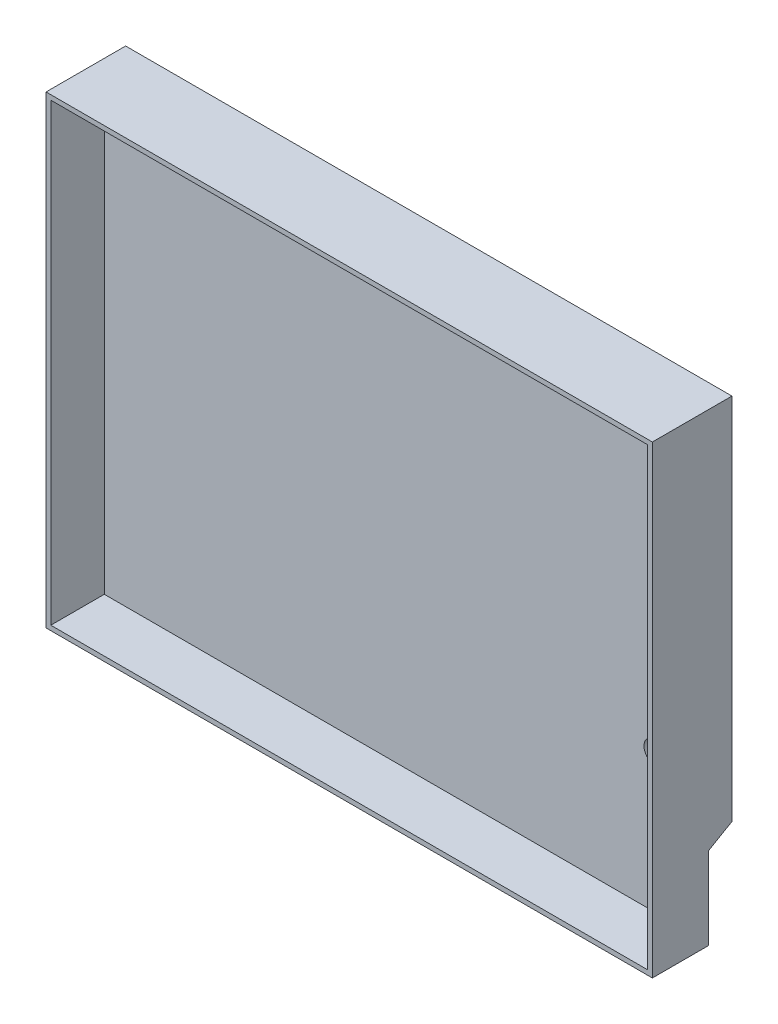
ISO-10303-21;
HEADER;
FILE_DESCRIPTION(('STEP AP214'),'2;1');
FILE_NAME('part.step','',(''),(''),'','','');
FILE_SCHEMA(('AUTOMOTIVE_DESIGN { 1 0 10303 214 1 1 1 1 }'));
ENDSEC;
DATA;
#1=APPLICATION_CONTEXT('core data for automotive mechanical design processes');
#2=APPLICATION_PROTOCOL_DEFINITION('international standard','automotive_design',2000,#1);
#3=PRODUCT_CONTEXT('',#1,'mechanical');
#4=PRODUCT('Part','Part','',(#3));
#5=PRODUCT_RELATED_PRODUCT_CATEGORY('part','',(#4));
#6=PRODUCT_DEFINITION_FORMATION('','',#4);
#7=PRODUCT_DEFINITION_CONTEXT('part definition',#1,'design');
#8=PRODUCT_DEFINITION('design','',#6,#7);
#9=PRODUCT_DEFINITION_SHAPE('','',#8);
#10=(LENGTH_UNIT() NAMED_UNIT(*) SI_UNIT(.MILLI.,.METRE.));
#11=(NAMED_UNIT(*) PLANE_ANGLE_UNIT() SI_UNIT($,.RADIAN.));
#12=(NAMED_UNIT(*) SI_UNIT($,.STERADIAN.) SOLID_ANGLE_UNIT());
#13=UNCERTAINTY_MEASURE_WITH_UNIT(LENGTH_MEASURE(1.E-05),#10,'distance_accuracy_value','');
#14=(GEOMETRIC_REPRESENTATION_CONTEXT(3) GLOBAL_UNCERTAINTY_ASSIGNED_CONTEXT((#13)) GLOBAL_UNIT_ASSIGNED_CONTEXT((#10,
#11,#12)) REPRESENTATION_CONTEXT('',''));
#15=CARTESIAN_POINT('',(0.,0.,0.));
#16=DIRECTION('',(0.,0.,1.));
#17=DIRECTION('',(1.,0.,0.));
#18=AXIS2_PLACEMENT_3D('',#15,#16,#17);
#19=CARTESIAN_POINT('',(-73.6844666960611,-68.0045533803645,11.8));
#20=DIRECTION('',(1.,0.,0.));
#21=DIRECTION('',(0.,0.,-1.));
#22=AXIS2_PLACEMENT_3D('',#19,#20,#21);
#23=PLANE('',#22);
#24=DIRECTION('',(0.,0.,-1.));
#25=VECTOR('',#24,1.);
#26=CARTESIAN_POINT('',(-73.6844666960611,29.9954466196355,11.8));
#27=LINE('',#26,#25);
#28=CARTESIAN_POINT('',(-73.6844666960611,29.9954466196355,11.8));
#29=VERTEX_POINT('',#28);
#30=CARTESIAN_POINT('',(-73.6844666960611,29.9954466196355,-4.99696657983621));
#31=VERTEX_POINT('',#30);
#32=EDGE_CURVE('E133',#29,#31,#27,.T.);
#33=ORIENTED_EDGE('',*,*,#32,.T.);
#34=DIRECTION('',(0.,-1.,0.));
#35=VECTOR('',#34,1.);
#36=CARTESIAN_POINT('',(-73.6844666960611,-47.7995533803645,-4.99696657983621));
#37=LINE('',#36,#35);
#38=CARTESIAN_POINT('',(-73.6844666960611,-47.7995533803645,-4.99696657983621));
#39=VERTEX_POINT('',#38);
#40=EDGE_CURVE('E141',#31,#39,#37,.T.);
#41=ORIENTED_EDGE('',*,*,#40,.T.);
#42=DIRECTION('',(0.,-0.5,0.866025403784439));
#43=VECTOR('',#42,1.);
#44=CARTESIAN_POINT('',(-73.6844666960611,-50.6845533803645,0.));
#45=LINE('',#44,#43);
#46=CARTESIAN_POINT('',(-73.6844666960611,-50.6845533803645,0.));
#47=VERTEX_POINT('',#46);
#48=EDGE_CURVE('E149',#39,#47,#45,.T.);
#49=ORIENTED_EDGE('',*,*,#48,.T.);
#50=DIRECTION('',(0.,-1.,0.));
#51=VECTOR('',#50,1.);
#52=CARTESIAN_POINT('',(-73.6844666960611,-68.0045533803645,0.));
#53=LINE('',#52,#51);
#54=CARTESIAN_POINT('',(-73.6844666960611,-68.0045533803645,0.));
#55=VERTEX_POINT('',#54);
#56=EDGE_CURVE('E200',#47,#55,#53,.T.);
#57=ORIENTED_EDGE('',*,*,#56,.T.);
#58=DIRECTION('',(0.,0.,-1.));
#59=VECTOR('',#58,1.);
#60=CARTESIAN_POINT('',(-73.6844666960611,-68.0045533803645,11.8));
#61=LINE('',#60,#59);
#62=CARTESIAN_POINT('',(-73.6844666960611,-68.0045533803645,11.8));
#63=VERTEX_POINT('',#62);
#64=EDGE_CURVE('E11',#63,#55,#61,.T.);
#65=ORIENTED_EDGE('',*,*,#64,.F.);
#66=DIRECTION('',(0.,-1.,0.));
#67=VECTOR('',#66,1.);
#68=CARTESIAN_POINT('',(-73.6844666960611,-68.0045533803645,11.8));
#69=LINE('',#68,#67);
#70=EDGE_CURVE('E209',#29,#63,#69,.T.);
#71=ORIENTED_EDGE('',*,*,#70,.F.);
#72=EDGE_LOOP('',(#33,#41,#49,#57,#65,#71));
#73=FACE_BOUND('',#72,.T.);
#74=ADVANCED_FACE('F43',(#73),#23,.F.);
#75=CARTESIAN_POINT('',(54.3155333039389,-68.0045533803645,11.8));
#76=DIRECTION('',(0.,1.,0.));
#77=DIRECTION('',(-1.,0.,0.));
#78=AXIS2_PLACEMENT_3D('',#75,#76,#77);
#79=PLANE('',#78);
#80=DIRECTION('',(1.,0.,0.));
#81=VECTOR('',#80,1.);
#82=CARTESIAN_POINT('',(54.3155333039389,-68.0045533803645,0.));
#83=LINE('',#82,#81);
#84=CARTESIAN_POINT('',(54.3155333039389,-68.0045533803645,0.));
#85=VERTEX_POINT('',#84);
#86=EDGE_CURVE('E224',#55,#85,#83,.T.);
#87=ORIENTED_EDGE('',*,*,#86,.T.);
#88=DIRECTION('',(0.,0.,-1.));
#89=VECTOR('',#88,1.);
#90=CARTESIAN_POINT('',(54.3155333039389,-68.0045533803645,11.8));
#91=LINE('',#90,#89);
#92=CARTESIAN_POINT('',(54.3155333039389,-68.0045533803645,11.8));
#93=VERTEX_POINT('',#92);
#94=EDGE_CURVE('E51',#93,#85,#91,.T.);
#95=ORIENTED_EDGE('',*,*,#94,.F.);
#96=DIRECTION('',(1.,0.,0.));
#97=VECTOR('',#96,1.);
#98=CARTESIAN_POINT('',(54.3155333039389,-68.0045533803645,11.8));
#99=LINE('',#98,#97);
#100=EDGE_CURVE('E213',#63,#93,#99,.T.);
#101=ORIENTED_EDGE('',*,*,#100,.F.);
#102=ORIENTED_EDGE('',*,*,#64,.T.);
#103=EDGE_LOOP('',(#87,#95,#101,#102));
#104=FACE_BOUND('',#103,.T.);
#105=ADVANCED_FACE('F237',(#104),#79,.F.);
#106=CARTESIAN_POINT('',(54.3155333039389,29.9954466196355,11.8));
#107=DIRECTION('',(-1.,0.,0.));
#108=DIRECTION('',(0.,-1.,0.));
#109=AXIS2_PLACEMENT_3D('',#106,#107,#108);
#110=PLANE('',#109);
#111=DIRECTION('',(0.,1.,0.));
#112=VECTOR('',#111,1.);
#113=CARTESIAN_POINT('',(54.3155333039389,29.9954466196355,0.));
#114=LINE('',#113,#112);
#115=CARTESIAN_POINT('',(54.3155333039389,-50.6845533803645,0.));
#116=VERTEX_POINT('',#115);
#117=EDGE_CURVE('E214',#85,#116,#114,.T.);
#118=ORIENTED_EDGE('',*,*,#117,.T.);
#119=DIRECTION('',(0.,-0.5,0.866025403784439));
#120=VECTOR('',#119,1.);
#121=CARTESIAN_POINT('',(54.3155333039389,-50.6845533803645,0.));
#122=LINE('',#121,#120);
#123=CARTESIAN_POINT('',(54.3155333039389,-47.7995533803645,-4.99696657983621));
#124=VERTEX_POINT('',#123);
#125=EDGE_CURVE('E144',#124,#116,#122,.T.);
#126=ORIENTED_EDGE('',*,*,#125,.F.);
#127=DIRECTION('',(0.,-1.,0.));
#128=VECTOR('',#127,1.);
#129=CARTESIAN_POINT('',(54.3155333039389,-47.7995533803645,-4.99696657983621));
#130=LINE('',#129,#128);
#131=CARTESIAN_POINT('',(54.3155333039389,29.9954466196355,-4.99696657983621));
#132=VERTEX_POINT('',#131);
#133=EDGE_CURVE('E138',#132,#124,#130,.T.);
#134=ORIENTED_EDGE('',*,*,#133,.F.);
#135=DIRECTION('',(0.,0.,-1.));
#136=VECTOR('',#135,1.);
#137=CARTESIAN_POINT('',(54.3155333039389,29.9954466196355,11.8));
#138=LINE('',#137,#136);
#139=CARTESIAN_POINT('',(54.3155333039389,29.9954466196355,11.8));
#140=VERTEX_POINT('',#139);
#141=EDGE_CURVE('E122',#140,#132,#138,.T.);
#142=ORIENTED_EDGE('',*,*,#141,.F.);
#143=DIRECTION('',(0.,1.,0.));
#144=VECTOR('',#143,1.);
#145=CARTESIAN_POINT('',(54.3155333039389,29.9954466196355,11.8));
#146=LINE('',#145,#144);
#147=EDGE_CURVE('E217',#93,#140,#146,.T.);
#148=ORIENTED_EDGE('',*,*,#147,.F.);
#149=ORIENTED_EDGE('',*,*,#94,.T.);
#150=EDGE_LOOP('',(#118,#126,#134,#142,#148,#149));
#151=FACE_BOUND('',#150,.T.);
#152=ADVANCED_FACE('F146',(#151),#110,.F.);
#153=CARTESIAN_POINT('',(-73.6844666960611,29.9954466196355,11.8));
#154=DIRECTION('',(0.,-1.,0.));
#155=DIRECTION('',(0.,0.,-1.));
#156=AXIS2_PLACEMENT_3D('',#153,#154,#155);
#157=PLANE('',#156);
#158=ORIENTED_EDGE('',*,*,#141,.T.);
#159=DIRECTION('',(-1.,0.,0.));
#160=VECTOR('',#159,1.);
#161=CARTESIAN_POINT('',(54.3155333039389,29.9954466196355,-4.99696657983621));
#162=LINE('',#161,#160);
#163=EDGE_CURVE('E126',#132,#31,#162,.T.);
#164=ORIENTED_EDGE('',*,*,#163,.T.);
#165=ORIENTED_EDGE('',*,*,#32,.F.);
#166=DIRECTION('',(-1.,0.,0.));
#167=VECTOR('',#166,1.);
#168=CARTESIAN_POINT('',(-73.6844666960611,29.9954466196355,11.8));
#169=LINE('',#168,#167);
#170=EDGE_CURVE('E128',#140,#29,#169,.T.);
#171=ORIENTED_EDGE('',*,*,#170,.F.);
#172=EDGE_LOOP('',(#158,#164,#165,#171));
#173=FACE_BOUND('',#172,.T.);
#174=ADVANCED_FACE('F124',(#173),#157,.F.);
#175=CARTESIAN_POINT('',(0.,0.,11.8));
#176=DIRECTION('',(0.,0.,-1.));
#177=DIRECTION('',(-1.,0.,0.));
#178=AXIS2_PLACEMENT_3D('',#175,#176,#177);
#179=PLANE('',#178);
#180=DIRECTION('',(0.,-1.,0.));
#181=VECTOR('',#180,1.);
#182=CARTESIAN_POINT('',(-72.6844666960611,28.9954466196355,11.8));
#183=LINE('',#182,#181);
#184=CARTESIAN_POINT('',(-72.6844666960611,28.9954466196355,11.8));
#185=VERTEX_POINT('',#184);
#186=CARTESIAN_POINT('',(-72.6844666960611,-67.0045533803645,11.8));
#187=VERTEX_POINT('',#186);
#188=EDGE_CURVE('E186',#185,#187,#183,.T.);
#189=ORIENTED_EDGE('',*,*,#188,.F.);
#190=DIRECTION('',(-1.,0.,0.));
#191=VECTOR('',#190,1.);
#192=CARTESIAN_POINT('',(53.3155333039388,28.9954466196355,11.8));
#193=LINE('',#192,#191);
#194=CARTESIAN_POINT('',(53.3155333039388,28.9954466196355,11.8));
#195=VERTEX_POINT('',#194);
#196=EDGE_CURVE('E66',#195,#185,#193,.T.);
#197=ORIENTED_EDGE('',*,*,#196,.F.);
#198=DIRECTION('',(0.,1.,0.));
#199=VECTOR('',#198,1.);
#200=CARTESIAN_POINT('',(53.3155333039388,-67.0045533803645,11.8));
#201=LINE('',#200,#199);
#202=CARTESIAN_POINT('',(53.3155333039388,-67.0045533803645,11.8));
#203=VERTEX_POINT('',#202);
#204=EDGE_CURVE('E171',#203,#195,#201,.T.);
#205=ORIENTED_EDGE('',*,*,#204,.F.);
#206=DIRECTION('',(1.,0.,0.));
#207=VECTOR('',#206,1.);
#208=CARTESIAN_POINT('',(-72.6844666960611,-67.0045533803645,11.8));
#209=LINE('',#208,#207);
#210=EDGE_CURVE('E190',#187,#203,#209,.T.);
#211=ORIENTED_EDGE('',*,*,#210,.F.);
#212=EDGE_LOOP('',(#189,#197,#205,#211));
#213=FACE_BOUND('',#212,.T.);
#214=ORIENTED_EDGE('',*,*,#70,.T.);
#215=ORIENTED_EDGE('',*,*,#100,.T.);
#216=ORIENTED_EDGE('',*,*,#147,.T.);
#217=ORIENTED_EDGE('',*,*,#170,.T.);
#218=EDGE_LOOP('',(#214,#215,#216,#217));
#219=FACE_BOUND('',#218,.T.);
#220=ADVANCED_FACE('F268',(#213,#219),#179,.F.);
#221=CARTESIAN_POINT('',(0.,0.,0.));
#222=DIRECTION('',(0.,0.,-1.));
#223=DIRECTION('',(-1.,0.,0.));
#224=AXIS2_PLACEMENT_3D('',#221,#222,#223);
#225=PLANE('',#224);
#226=DIRECTION('',(-1.,0.,0.));
#227=VECTOR('',#226,1.);
#228=CARTESIAN_POINT('',(54.3155333039389,-50.6845533803645,0.));
#229=LINE('',#228,#227);
#230=EDGE_CURVE('E58',#116,#47,#229,.T.);
#231=ORIENTED_EDGE('',*,*,#230,.F.);
#232=ORIENTED_EDGE('',*,*,#117,.F.);
#233=ORIENTED_EDGE('',*,*,#86,.F.);
#234=ORIENTED_EDGE('',*,*,#56,.F.);
#235=EDGE_LOOP('',(#231,#232,#233,#234));
#236=FACE_BOUND('',#235,.T.);
#237=ADVANCED_FACE('F235',(#236),#225,.T.);
#238=CARTESIAN_POINT('',(53.3155333039388,28.9954466196355,0.5));
#239=DIRECTION('',(0.,1.,0.));
#240=DIRECTION('',(-1.,0.,0.));
#241=AXIS2_PLACEMENT_3D('',#238,#239,#240);
#242=PLANE('',#241);
#243=ORIENTED_EDGE('',*,*,#196,.T.);
#244=DIRECTION('',(0.,0.,1.));
#245=VECTOR('',#244,1.);
#246=CARTESIAN_POINT('',(-72.6844666960611,28.9954466196355,0.5));
#247=LINE('',#246,#245);
#248=CARTESIAN_POINT('',(-72.6844666960611,28.9954466196355,0.5));
#249=VERTEX_POINT('',#248);
#250=EDGE_CURVE('E183',#249,#185,#247,.T.);
#251=ORIENTED_EDGE('',*,*,#250,.F.);
#252=DIRECTION('',(-1.,0.,0.));
#253=VECTOR('',#252,1.);
#254=CARTESIAN_POINT('',(53.3155333039388,28.9954466196355,0.5));
#255=LINE('',#254,#253);
#256=CARTESIAN_POINT('',(53.3155333039388,28.9954466196355,0.5));
#257=VERTEX_POINT('',#256);
#258=EDGE_CURVE('E166',#257,#249,#255,.T.);
#259=ORIENTED_EDGE('',*,*,#258,.F.);
#260=DIRECTION('',(0.,0.,1.));
#261=VECTOR('',#260,1.);
#262=CARTESIAN_POINT('',(53.3155333039388,28.9954466196355,0.5));
#263=LINE('',#262,#261);
#264=EDGE_CURVE('E197',#257,#195,#263,.T.);
#265=ORIENTED_EDGE('',*,*,#264,.T.);
#266=EDGE_LOOP('',(#243,#251,#259,#265));
#267=FACE_BOUND('',#266,.T.);
#268=ADVANCED_FACE('F271',(#267),#242,.F.);
#269=CARTESIAN_POINT('',(53.3155333039388,-67.0045533803645,0.5));
#270=DIRECTION('',(1.,0.,0.));
#271=DIRECTION('',(0.,0.,-1.));
#272=AXIS2_PLACEMENT_3D('',#269,#270,#271);
#273=PLANE('',#272);
#274=ORIENTED_EDGE('',*,*,#204,.T.);
#275=ORIENTED_EDGE('',*,*,#264,.F.);
#276=DIRECTION('',(0.,1.,0.));
#277=VECTOR('',#276,1.);
#278=CARTESIAN_POINT('',(53.3155333039388,-67.0045533803645,0.5));
#279=LINE('',#278,#277);
#280=CARTESIAN_POINT('',(53.3155333039388,-67.0045533803645,0.5));
#281=VERTEX_POINT('',#280);
#282=EDGE_CURVE('E179',#281,#257,#279,.T.);
#283=ORIENTED_EDGE('',*,*,#282,.F.);
#284=DIRECTION('',(0.,0.,1.));
#285=VECTOR('',#284,1.);
#286=CARTESIAN_POINT('',(53.3155333039388,-67.0045533803645,0.5));
#287=LINE('',#286,#285);
#288=EDGE_CURVE('E201',#281,#203,#287,.T.);
#289=ORIENTED_EDGE('',*,*,#288,.T.);
#290=EDGE_LOOP('',(#274,#275,#283,#289));
#291=FACE_BOUND('',#290,.T.);
#292=ADVANCED_FACE('F277',(#291),#273,.F.);
#293=CARTESIAN_POINT('',(-72.6844666960611,-67.0045533803645,0.5));
#294=DIRECTION('',(0.,-1.,0.));
#295=DIRECTION('',(0.,0.,-1.));
#296=AXIS2_PLACEMENT_3D('',#293,#294,#295);
#297=PLANE('',#296);
#298=ORIENTED_EDGE('',*,*,#210,.T.);
#299=ORIENTED_EDGE('',*,*,#288,.F.);
#300=DIRECTION('',(1.,0.,0.));
#301=VECTOR('',#300,1.);
#302=CARTESIAN_POINT('',(-72.6844666960611,-67.0045533803645,0.5));
#303=LINE('',#302,#301);
#304=CARTESIAN_POINT('',(-72.6844666960611,-67.0045533803645,0.5));
#305=VERTEX_POINT('',#304);
#306=EDGE_CURVE('E175',#305,#281,#303,.T.);
#307=ORIENTED_EDGE('',*,*,#306,.F.);
#308=DIRECTION('',(0.,0.,1.));
#309=VECTOR('',#308,1.);
#310=CARTESIAN_POINT('',(-72.6844666960611,-67.0045533803645,0.5));
#311=LINE('',#310,#309);
#312=EDGE_CURVE('E204',#305,#187,#311,.T.);
#313=ORIENTED_EDGE('',*,*,#312,.T.);
#314=EDGE_LOOP('',(#298,#299,#307,#313));
#315=FACE_BOUND('',#314,.T.);
#316=ADVANCED_FACE('F280',(#315),#297,.F.);
#317=CARTESIAN_POINT('',(-72.6844666960611,28.9954466196355,0.5));
#318=DIRECTION('',(-1.,0.,0.));
#319=DIRECTION('',(0.,0.,1.));
#320=AXIS2_PLACEMENT_3D('',#317,#318,#319);
#321=PLANE('',#320);
#322=ORIENTED_EDGE('',*,*,#188,.T.);
#323=ORIENTED_EDGE('',*,*,#312,.F.);
#324=DIRECTION('',(0.,-1.,0.));
#325=VECTOR('',#324,1.);
#326=CARTESIAN_POINT('',(-72.6844666960611,28.9954466196355,0.5));
#327=LINE('',#326,#325);
#328=EDGE_CURVE('E170',#249,#305,#327,.T.);
#329=ORIENTED_EDGE('',*,*,#328,.F.);
#330=ORIENTED_EDGE('',*,*,#250,.T.);
#331=EDGE_LOOP('',(#322,#323,#329,#330));
#332=FACE_BOUND('',#331,.T.);
#333=ADVANCED_FACE('F253',(#332),#321,.F.);
#334=CARTESIAN_POINT('',(0.,0.,0.5));
#335=DIRECTION('',(0.,0.,1.));
#336=DIRECTION('',(1.,0.,0.));
#337=AXIS2_PLACEMENT_3D('',#334,#335,#336);
#338=PLANE('',#337);
#339=CARTESIAN_POINT('',(43.7510566558631,-37.7679248019306,0.5));
#340=DIRECTION('',(0.,0.,1.));
#341=DIRECTION('',(1.,0.,0.));
#342=AXIS2_PLACEMENT_3D('',#339,#340,#341);
#343=CIRCLE('',#342,2.5);
#344=CARTESIAN_POINT('',(46.2510566558631,-37.7679248019306,0.5));
#345=VERTEX_POINT('',#344);
#346=EDGE_CURVE('E157',#345,#345,#343,.T.);
#347=ORIENTED_EDGE('',*,*,#346,.F.);
#348=EDGE_LOOP('',(#347));
#349=FACE_BOUND('',#348,.T.);
#350=ORIENTED_EDGE('',*,*,#258,.T.);
#351=ORIENTED_EDGE('',*,*,#328,.T.);
#352=ORIENTED_EDGE('',*,*,#306,.T.);
#353=ORIENTED_EDGE('',*,*,#282,.T.);
#354=EDGE_LOOP('',(#350,#351,#352,#353));
#355=FACE_BOUND('',#354,.T.);
#356=ADVANCED_FACE('F244',(#349,#355),#338,.T.);
#357=CARTESIAN_POINT('',(54.3155333039389,-50.6845533803645,0.));
#358=DIRECTION('',(0.,-0.866025403784439,-0.5));
#359=DIRECTION('',(0.,0.5,-0.866025403784439));
#360=AXIS2_PLACEMENT_3D('',#357,#358,#359);
#361=PLANE('',#360);
#362=ORIENTED_EDGE('',*,*,#48,.F.);
#363=DIRECTION('',(-1.,0.,0.));
#364=VECTOR('',#363,1.);
#365=CARTESIAN_POINT('',(54.3155333039389,-47.7995533803645,-4.99696657983621));
#366=LINE('',#365,#364);
#367=EDGE_CURVE('E143',#124,#39,#366,.T.);
#368=ORIENTED_EDGE('',*,*,#367,.F.);
#369=ORIENTED_EDGE('',*,*,#125,.T.);
#370=ORIENTED_EDGE('',*,*,#230,.T.);
#371=EDGE_LOOP('',(#362,#368,#369,#370));
#372=FACE_BOUND('',#371,.T.);
#373=ADVANCED_FACE('F242',(#372),#361,.T.);
#374=CARTESIAN_POINT('',(54.3155333039389,-47.7995533803645,-4.99696657983621));
#375=DIRECTION('',(0.,0.,-1.));
#376=DIRECTION('',(0.,1.,0.));
#377=AXIS2_PLACEMENT_3D('',#374,#375,#376);
#378=PLANE('',#377);
#379=CARTESIAN_POINT('',(43.7510566558631,-37.7679248019306,-4.99696657983621));
#380=DIRECTION('',(0.,0.,-1.));
#381=DIRECTION('',(0.,1.,0.));
#382=AXIS2_PLACEMENT_3D('',#379,#380,#381);
#383=CIRCLE('',#382,2.5);
#384=CARTESIAN_POINT('',(43.7510566558631,-35.2679248019306,-4.99696657983621));
#385=VERTEX_POINT('',#384);
#386=EDGE_CURVE('E418',#385,#385,#383,.T.);
#387=ORIENTED_EDGE('',*,*,#386,.F.);
#388=EDGE_LOOP('',(#387));
#389=FACE_BOUND('',#388,.T.);
#390=ORIENTED_EDGE('',*,*,#40,.F.);
#391=ORIENTED_EDGE('',*,*,#163,.F.);
#392=ORIENTED_EDGE('',*,*,#133,.T.);
#393=ORIENTED_EDGE('',*,*,#367,.T.);
#394=EDGE_LOOP('',(#390,#391,#392,#393));
#395=FACE_BOUND('',#394,.T.);
#396=ADVANCED_FACE('F137',(#389,#395),#378,.T.);
#397=CARTESIAN_POINT('',(43.7510566558631,-37.7679248019306,17.0030334201638));
#398=DIRECTION('',(0.,0.,-1.));
#399=DIRECTION('',(0.,1.,0.));
#400=AXIS2_PLACEMENT_3D('',#397,#398,#399);
#401=CYLINDRICAL_SURFACE('',#400,2.5);
#402=ORIENTED_EDGE('',*,*,#346,.T.);
#403=EDGE_LOOP('',(#402));
#404=FACE_BOUND('',#403,.T.);
#405=ORIENTED_EDGE('',*,*,#386,.T.);
#406=EDGE_LOOP('',(#405));
#407=FACE_BOUND('',#406,.T.);
#408=ADVANCED_FACE('F250',(#404,#407),#401,.F.);
#409=CLOSED_SHELL('',(#74,#105,#152,#174,#220,#237,#268,#292,#316,#333,#356,#373,#396,#408));
#410=MANIFOLD_SOLID_BREP('B2',#409);
#411=ADVANCED_BREP_SHAPE_REPRESENTATION('',(#18,#410),#14);
#412=SHAPE_DEFINITION_REPRESENTATION(#9,#411);
ENDSEC;
END-ISO-10303-21;
